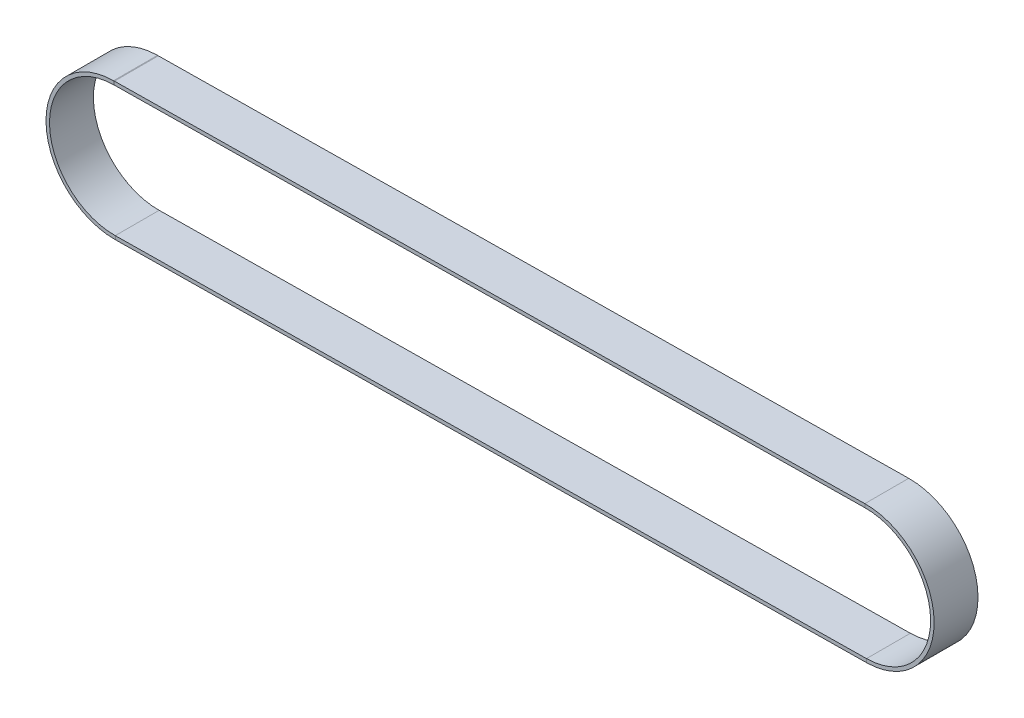
ISO-10303-21;
HEADER;
FILE_DESCRIPTION(('STEP AP214'),'2;1');
FILE_NAME('part.step','',(''),(''),'','','');
FILE_SCHEMA(('AUTOMOTIVE_DESIGN { 1 0 10303 214 1 1 1 1 }'));
ENDSEC;
DATA;
#1=APPLICATION_CONTEXT('core data for automotive mechanical design processes');
#2=APPLICATION_PROTOCOL_DEFINITION('international standard','automotive_design',2000,#1);
#3=PRODUCT_CONTEXT('',#1,'mechanical');
#4=PRODUCT('Part','Part','',(#3));
#5=PRODUCT_RELATED_PRODUCT_CATEGORY('part','',(#4));
#6=PRODUCT_DEFINITION_FORMATION('','',#4);
#7=PRODUCT_DEFINITION_CONTEXT('part definition',#1,'design');
#8=PRODUCT_DEFINITION('design','',#6,#7);
#9=PRODUCT_DEFINITION_SHAPE('','',#8);
#10=(LENGTH_UNIT() NAMED_UNIT(*) SI_UNIT(.MILLI.,.METRE.));
#11=(NAMED_UNIT(*) PLANE_ANGLE_UNIT() SI_UNIT($,.RADIAN.));
#12=(NAMED_UNIT(*) SI_UNIT($,.STERADIAN.) SOLID_ANGLE_UNIT());
#13=UNCERTAINTY_MEASURE_WITH_UNIT(LENGTH_MEASURE(1.E-05),#10,'distance_accuracy_value','');
#14=(GEOMETRIC_REPRESENTATION_CONTEXT(3) GLOBAL_UNCERTAINTY_ASSIGNED_CONTEXT((#13)) GLOBAL_UNIT_ASSIGNED_CONTEXT((#10,
#11,#12)) REPRESENTATION_CONTEXT('',''));
#15=CARTESIAN_POINT('',(0.,0.,0.));
#16=DIRECTION('',(0.,0.,1.));
#17=DIRECTION('',(1.,0.,0.));
#18=AXIS2_PLACEMENT_3D('',#15,#16,#17);
#19=CARTESIAN_POINT('',(427.495798297493,44.299378727653,12.5000000000001));
#20=DIRECTION('',(0.,0.,-1.));
#21=DIRECTION('',(-1.,0.,0.));
#22=AXIS2_PLACEMENT_3D('',#19,#20,#21);
#23=PLANE('',#22);
#24=DIRECTION('',(0.,-1.,0.));
#25=VECTOR('',#24,1.);
#26=CARTESIAN_POINT('',(427.495798297493,44.299378727653,12.5000000000001));
#27=LINE('',#26,#25);
#28=CARTESIAN_POINT('',(427.495798297493,44.299378727653,12.5000000000001));
#29=VERTEX_POINT('',#28);
#30=CARTESIAN_POINT('',(427.495798297493,42.299378727653,12.5000000000001));
#31=VERTEX_POINT('',#30);
#32=EDGE_CURVE('E169',#29,#31,#27,.T.);
#33=ORIENTED_EDGE('',*,*,#32,.F.);
#34=DIRECTION('',(-0.999923089611127,-0.0124022120018218,0.));
#35=VECTOR('',#34,1.);
#36=CARTESIAN_POINT('',(427.495798297493,44.299378727653,12.5000000000001));
#37=LINE('',#36,#35);
#38=CARTESIAN_POINT('',(0.,38.9970774052228,12.5000000000001));
#39=VERTEX_POINT('',#38);
#40=EDGE_CURVE('E168',#29,#39,#37,.T.);
#41=ORIENTED_EDGE('',*,*,#40,.T.);
#42=DIRECTION('',(0.,-1.,0.));
#43=VECTOR('',#42,1.);
#44=CARTESIAN_POINT('',(0.,38.9970774052228,12.5000000000001));
#45=LINE('',#44,#43);
#46=CARTESIAN_POINT('',(0.,36.9970774052228,12.5000000000001));
#47=VERTEX_POINT('',#46);
#48=EDGE_CURVE('E143',#39,#47,#45,.T.);
#49=ORIENTED_EDGE('',*,*,#48,.T.);
#50=DIRECTION('',(-0.999923089611127,-0.0124022120018218,0.));
#51=VECTOR('',#50,1.);
#52=CARTESIAN_POINT('',(427.495798297493,42.299378727653,12.5000000000001));
#53=LINE('',#52,#51);
#54=EDGE_CURVE('E173',#31,#47,#53,.T.);
#55=ORIENTED_EDGE('',*,*,#54,.F.);
#56=EDGE_LOOP('',(#33,#41,#49,#55));
#57=FACE_BOUND('',#56,.T.);
#58=ADVANCED_FACE('F35',(#57),#23,.F.);
#59=CARTESIAN_POINT('',(0.,38.9970774052228,12.5000000000001));
#60=DIRECTION('',(0.,0.,-1.));
#61=DIRECTION('',(-1.,0.,0.));
#62=AXIS2_PLACEMENT_3D('',#59,#60,#61);
#63=PLANE('',#62);
#64=DIRECTION('',(-0.999923089611127,-0.0124022120018218,0.));
#65=VECTOR('',#64,1.);
#66=CARTESIAN_POINT('',(0.,36.9970774052228,12.5000000000001));
#67=LINE('',#66,#65);
#68=CARTESIAN_POINT('',(-0.471284056069227,36.9912319908733,12.5000000000001));
#69=VERTEX_POINT('',#68);
#70=EDGE_CURVE('E149',#47,#69,#67,.T.);
#71=ORIENTED_EDGE('',*,*,#70,.F.);
#72=ORIENTED_EDGE('',*,*,#48,.F.);
#73=DIRECTION('',(-0.999923089611127,-0.0124022120018218,0.));
#74=VECTOR('',#73,1.);
#75=CARTESIAN_POINT('',(0.,38.9970774052228,12.5000000000001));
#76=LINE('',#75,#74);
#77=CARTESIAN_POINT('',(-0.471284056069227,38.9912319908733,12.5000000000001));
#78=VERTEX_POINT('',#77);
#79=EDGE_CURVE('E147',#39,#78,#76,.T.);
#80=ORIENTED_EDGE('',*,*,#79,.T.);
#81=DIRECTION('',(0.,-1.,0.));
#82=VECTOR('',#81,1.);
#83=CARTESIAN_POINT('',(-0.471284056069227,38.9912319908733,12.5000000000001));
#84=LINE('',#83,#82);
#85=EDGE_CURVE('E165',#78,#69,#84,.T.);
#86=ORIENTED_EDGE('',*,*,#85,.T.);
#87=EDGE_LOOP('',(#71,#72,#80,#86));
#88=FACE_BOUND('',#87,.T.);
#89=ADVANCED_FACE('F145',(#88),#63,.F.);
#90=CARTESIAN_POINT('',(0.,36.9970774052228,12.5000000000001));
#91=DIRECTION('',(-0.0124022120018218,0.999923089611127,0.));
#92=DIRECTION('',(-0.999923089611127,-0.0124022120018218,0.));
#93=AXIS2_PLACEMENT_3D('',#90,#91,#92);
#94=PLANE('',#93);
#95=DIRECTION('',(-0.999923089611127,-0.0124022120018218,0.));
#96=VECTOR('',#95,1.);
#97=CARTESIAN_POINT('',(0.,36.9970774052228,-12.4999999999999));
#98=LINE('',#97,#96);
#99=CARTESIAN_POINT('',(0.,36.9970774052228,-12.4999999999999));
#100=VERTEX_POINT('',#99);
#101=CARTESIAN_POINT('',(-0.471284056069227,36.9912319908733,-12.4999999999999));
#102=VERTEX_POINT('',#101);
#103=EDGE_CURVE('E214',#100,#102,#98,.T.);
#104=ORIENTED_EDGE('',*,*,#103,.F.);
#105=DIRECTION('',(0.,0.,-1.));
#106=VECTOR('',#105,1.);
#107=CARTESIAN_POINT('',(0.,36.9970774052228,12.5000000000001));
#108=LINE('',#107,#106);
#109=EDGE_CURVE('E154',#47,#100,#108,.T.);
#110=ORIENTED_EDGE('',*,*,#109,.F.);
#111=ORIENTED_EDGE('',*,*,#70,.T.);
#112=DIRECTION('',(0.,0.,-1.));
#113=VECTOR('',#112,1.);
#114=CARTESIAN_POINT('',(-0.471284056069227,36.9912319908733,12.5000000000001));
#115=LINE('',#114,#113);
#116=EDGE_CURVE('E239',#69,#102,#115,.T.);
#117=ORIENTED_EDGE('',*,*,#116,.T.);
#118=EDGE_LOOP('',(#104,#110,#111,#117));
#119=FACE_BOUND('',#118,.T.);
#120=ADVANCED_FACE('F259',(#119),#94,.F.);
#121=CARTESIAN_POINT('',(0.,38.9970774052228,-12.4999999999999));
#122=DIRECTION('',(0.,0.,1.));
#123=DIRECTION('',(0.,-1.,0.));
#124=AXIS2_PLACEMENT_3D('',#121,#122,#123);
#125=PLANE('',#124);
#126=DIRECTION('',(-0.999923089611127,-0.0124022120018218,0.));
#127=VECTOR('',#126,1.);
#128=CARTESIAN_POINT('',(0.,38.9970774052228,-12.4999999999999));
#129=LINE('',#128,#127);
#130=CARTESIAN_POINT('',(0.,38.9970774052228,-12.4999999999999));
#131=VERTEX_POINT('',#130);
#132=CARTESIAN_POINT('',(-0.471284056069227,38.9912319908733,-12.4999999999999));
#133=VERTEX_POINT('',#132);
#134=EDGE_CURVE('E184',#131,#133,#129,.T.);
#135=ORIENTED_EDGE('',*,*,#134,.F.);
#136=DIRECTION('',(0.,1.,0.));
#137=VECTOR('',#136,1.);
#138=CARTESIAN_POINT('',(0.,38.9970774052228,-12.4999999999999));
#139=LINE('',#138,#137);
#140=EDGE_CURVE('E176',#100,#131,#139,.T.);
#141=ORIENTED_EDGE('',*,*,#140,.F.);
#142=ORIENTED_EDGE('',*,*,#103,.T.);
#143=DIRECTION('',(0.,1.,0.));
#144=VECTOR('',#143,1.);
#145=CARTESIAN_POINT('',(-0.471284056069227,38.9912319908733,-12.4999999999999));
#146=LINE('',#145,#144);
#147=EDGE_CURVE('E216',#102,#133,#146,.T.);
#148=ORIENTED_EDGE('',*,*,#147,.T.);
#149=EDGE_LOOP('',(#135,#141,#142,#148));
#150=FACE_BOUND('',#149,.T.);
#151=ADVANCED_FACE('F212',(#150),#125,.F.);
#152=CARTESIAN_POINT('',(0.,38.9970774052228,12.5000000000001));
#153=DIRECTION('',(0.0124022120018218,-0.999923089611127,0.));
#154=DIRECTION('',(0.999923089611127,0.0124022120018218,0.));
#155=AXIS2_PLACEMENT_3D('',#152,#153,#154);
#156=PLANE('',#155);
#157=DIRECTION('',(0.,0.,1.));
#158=VECTOR('',#157,1.);
#159=CARTESIAN_POINT('',(-0.471284056069227,38.9912319908733,12.5000000000001));
#160=LINE('',#159,#158);
#161=EDGE_CURVE('E163',#133,#78,#160,.T.);
#162=ORIENTED_EDGE('',*,*,#161,.T.);
#163=ORIENTED_EDGE('',*,*,#79,.F.);
#164=DIRECTION('',(0.,0.,1.));
#165=VECTOR('',#164,1.);
#166=CARTESIAN_POINT('',(0.,38.9970774052228,12.5000000000001));
#167=LINE('',#166,#165);
#168=EDGE_CURVE('E161',#131,#39,#167,.T.);
#169=ORIENTED_EDGE('',*,*,#168,.F.);
#170=ORIENTED_EDGE('',*,*,#134,.T.);
#171=EDGE_LOOP('',(#162,#163,#169,#170));
#172=FACE_BOUND('',#171,.T.);
#173=ADVANCED_FACE('F159',(#172),#156,.F.);
#174=CARTESIAN_POINT('',(-0.471284056069228,38.9912319908733,12.5000000000001));
#175=DIRECTION('',(0.,0.,-1.));
#176=DIRECTION('',(-1.,0.,0.));
#177=AXIS2_PLACEMENT_3D('',#174,#175,#176);
#178=PLANE('',#177);
#179=CARTESIAN_POINT('',(0.,0.,12.5000000000001));
#180=DIRECTION('',(0.,0.,1.));
#181=DIRECTION('',(-0.0127393921832897,0.999918850650792,0.));
#182=AXIS2_PLACEMENT_3D('',#179,#180,#181);
#183=CIRCLE('',#182,36.9942340488908);
#184=CARTESIAN_POINT('',(0.471284056069207,-36.9912319908733,12.5000000000001));
#185=VERTEX_POINT('',#184);
#186=EDGE_CURVE('E128',#69,#185,#183,.T.);
#187=ORIENTED_EDGE('',*,*,#186,.F.);
#188=ORIENTED_EDGE('',*,*,#85,.F.);
#189=CARTESIAN_POINT('',(0.,0.,12.5000000000001));
#190=DIRECTION('',(0.,0.,1.));
#191=DIRECTION('',(-0.0120860411419707,0.99992696113742,0.));
#192=AXIS2_PLACEMENT_3D('',#189,#190,#191);
#193=CIRCLE('',#192,38.9940800741293);
#194=CARTESIAN_POINT('',(0.471284056069205,-38.9912319908733,12.5000000000001));
#195=VERTEX_POINT('',#194);
#196=EDGE_CURVE('E183',#78,#195,#193,.T.);
#197=ORIENTED_EDGE('',*,*,#196,.T.);
#198=DIRECTION('',(0.,1.,0.));
#199=VECTOR('',#198,1.);
#200=CARTESIAN_POINT('',(0.471284056069205,-38.9912319908733,12.5000000000001));
#201=LINE('',#200,#199);
#202=EDGE_CURVE('E244',#195,#185,#201,.T.);
#203=ORIENTED_EDGE('',*,*,#202,.T.);
#204=EDGE_LOOP('',(#187,#188,#197,#203));
#205=FACE_BOUND('',#204,.T.);
#206=ADVANCED_FACE('F284',(#205),#178,.F.);
#207=CARTESIAN_POINT('',(0.,0.,0.));
#208=DIRECTION('',(0.,0.,1.));
#209=DIRECTION('',(1.,0.,0.));
#210=AXIS2_PLACEMENT_3D('',#207,#208,#209);
#211=CYLINDRICAL_SURFACE('',#210,36.9942340488908);
#212=CARTESIAN_POINT('',(0.,0.,-12.4999999999999));
#213=DIRECTION('',(0.,0.,1.));
#214=DIRECTION('',(-0.0127393921832897,0.999918850650792,0.));
#215=AXIS2_PLACEMENT_3D('',#212,#213,#214);
#216=CIRCLE('',#215,36.9942340488908);
#217=CARTESIAN_POINT('',(0.471284056069207,-36.9912319908733,-12.4999999999999));
#218=VERTEX_POINT('',#217);
#219=EDGE_CURVE('E122',#102,#218,#216,.T.);
#220=ORIENTED_EDGE('',*,*,#219,.F.);
#221=ORIENTED_EDGE('',*,*,#116,.F.);
#222=ORIENTED_EDGE('',*,*,#186,.T.);
#223=DIRECTION('',(0.,0.,-1.));
#224=VECTOR('',#223,1.);
#225=CARTESIAN_POINT('',(0.471284056069206,-36.9912319908733,12.5000000000001));
#226=LINE('',#225,#224);
#227=EDGE_CURVE('E221',#185,#218,#226,.T.);
#228=ORIENTED_EDGE('',*,*,#227,.T.);
#229=EDGE_LOOP('',(#220,#221,#222,#228));
#230=FACE_BOUND('',#229,.T.);
#231=ADVANCED_FACE('F286',(#230),#211,.F.);
#232=CARTESIAN_POINT('',(-0.471284056069228,38.9912319908733,-12.4999999999999));
#233=DIRECTION('',(0.,0.,1.));
#234=DIRECTION('',(1.,0.,0.));
#235=AXIS2_PLACEMENT_3D('',#232,#233,#234);
#236=PLANE('',#235);
#237=CARTESIAN_POINT('',(0.,0.,-12.4999999999999));
#238=DIRECTION('',(0.,0.,1.));
#239=DIRECTION('',(-0.0120860411419707,0.99992696113742,0.));
#240=AXIS2_PLACEMENT_3D('',#237,#238,#239);
#241=CIRCLE('',#240,38.9940800741293);
#242=CARTESIAN_POINT('',(0.471284056069205,-38.9912319908733,-12.4999999999999));
#243=VERTEX_POINT('',#242);
#244=EDGE_CURVE('E188',#133,#243,#241,.T.);
#245=ORIENTED_EDGE('',*,*,#244,.F.);
#246=ORIENTED_EDGE('',*,*,#147,.F.);
#247=ORIENTED_EDGE('',*,*,#219,.T.);
#248=DIRECTION('',(0.,-1.,0.));
#249=VECTOR('',#248,1.);
#250=CARTESIAN_POINT('',(0.471284056069205,-38.9912319908733,-12.4999999999999));
#251=LINE('',#250,#249);
#252=EDGE_CURVE('E220',#218,#243,#251,.T.);
#253=ORIENTED_EDGE('',*,*,#252,.T.);
#254=EDGE_LOOP('',(#245,#246,#247,#253));
#255=FACE_BOUND('',#254,.T.);
#256=ADVANCED_FACE('F292',(#255),#236,.F.);
#257=CARTESIAN_POINT('',(0.,0.,0.));
#258=DIRECTION('',(0.,0.,1.));
#259=DIRECTION('',(1.,0.,0.));
#260=AXIS2_PLACEMENT_3D('',#257,#258,#259);
#261=CYLINDRICAL_SURFACE('',#260,38.9940800741293);
#262=DIRECTION('',(0.,0.,1.));
#263=VECTOR('',#262,1.);
#264=CARTESIAN_POINT('',(0.471284056069205,-38.9912319908733,12.5000000000001));
#265=LINE('',#264,#263);
#266=EDGE_CURVE('E185',#243,#195,#265,.T.);
#267=ORIENTED_EDGE('',*,*,#266,.T.);
#268=ORIENTED_EDGE('',*,*,#196,.F.);
#269=ORIENTED_EDGE('',*,*,#161,.F.);
#270=ORIENTED_EDGE('',*,*,#244,.T.);
#271=EDGE_LOOP('',(#267,#268,#269,#270));
#272=FACE_BOUND('',#271,.T.);
#273=ADVANCED_FACE('F282',(#272),#261,.T.);
#274=CARTESIAN_POINT('',(0.471284056069221,-38.9912319908733,12.5000000000001));
#275=DIRECTION('',(0.,0.,-1.));
#276=DIRECTION('',(-1.,0.,0.));
#277=AXIS2_PLACEMENT_3D('',#274,#275,#276);
#278=PLANE('',#277);
#279=DIRECTION('',(0.999923089611127,0.0124022120018218,0.));
#280=VECTOR('',#279,1.);
#281=CARTESIAN_POINT('',(0.471284056069221,-36.9912319908733,12.5000000000001));
#282=LINE('',#281,#280);
#283=CARTESIAN_POINT('',(428.438366409632,-31.6830852540936,12.5000000000001));
#284=VERTEX_POINT('',#283);
#285=EDGE_CURVE('E105',#185,#284,#282,.T.);
#286=ORIENTED_EDGE('',*,*,#285,.F.);
#287=ORIENTED_EDGE('',*,*,#202,.F.);
#288=DIRECTION('',(0.999923089611127,0.0124022120018218,0.));
#289=VECTOR('',#288,1.);
#290=CARTESIAN_POINT('',(0.471284056069221,-38.9912319908733,12.5000000000001));
#291=LINE('',#290,#289);
#292=CARTESIAN_POINT('',(428.438366409632,-33.6830852540936,12.5000000000001));
#293=VERTEX_POINT('',#292);
#294=EDGE_CURVE('E187',#195,#293,#291,.T.);
#295=ORIENTED_EDGE('',*,*,#294,.T.);
#296=DIRECTION('',(0.,1.,0.));
#297=VECTOR('',#296,1.);
#298=CARTESIAN_POINT('',(428.438366409632,-33.6830852540936,12.5000000000001));
#299=LINE('',#298,#297);
#300=EDGE_CURVE('E197',#293,#284,#299,.T.);
#301=ORIENTED_EDGE('',*,*,#300,.T.);
#302=EDGE_LOOP('',(#286,#287,#295,#301));
#303=FACE_BOUND('',#302,.T.);
#304=ADVANCED_FACE('F278',(#303),#278,.F.);
#305=CARTESIAN_POINT('',(0.471284056069221,-36.9912319908733,12.5000000000001));
#306=DIRECTION('',(0.0124022120018218,-0.999923089611127,0.));
#307=DIRECTION('',(0.999923089611127,0.0124022120018218,0.));
#308=AXIS2_PLACEMENT_3D('',#305,#306,#307);
#309=PLANE('',#308);
#310=DIRECTION('',(0.999923089611127,0.0124022120018218,0.));
#311=VECTOR('',#310,1.);
#312=CARTESIAN_POINT('',(0.471284056069221,-36.9912319908733,-12.4999999999999));
#313=LINE('',#312,#311);
#314=CARTESIAN_POINT('',(428.438366409632,-31.6830852540936,-12.4999999999999));
#315=VERTEX_POINT('',#314);
#316=EDGE_CURVE('E98',#218,#315,#313,.T.);
#317=ORIENTED_EDGE('',*,*,#316,.F.);
#318=ORIENTED_EDGE('',*,*,#227,.F.);
#319=ORIENTED_EDGE('',*,*,#285,.T.);
#320=DIRECTION('',(0.,0.,-1.));
#321=VECTOR('',#320,1.);
#322=CARTESIAN_POINT('',(428.438366409632,-31.6830852540936,12.5000000000001));
#323=LINE('',#322,#321);
#324=EDGE_CURVE('E195',#284,#315,#323,.T.);
#325=ORIENTED_EDGE('',*,*,#324,.T.);
#326=EDGE_LOOP('',(#317,#318,#319,#325));
#327=FACE_BOUND('',#326,.T.);
#328=ADVANCED_FACE('F281',(#327),#309,.F.);
#329=CARTESIAN_POINT('',(0.471284056069221,-38.9912319908733,-12.4999999999999));
#330=DIRECTION('',(0.,0.,1.));
#331=DIRECTION('',(0.,-1.,0.));
#332=AXIS2_PLACEMENT_3D('',#329,#330,#331);
#333=PLANE('',#332);
#334=DIRECTION('',(0.999923089611127,0.0124022120018218,0.));
#335=VECTOR('',#334,1.);
#336=CARTESIAN_POINT('',(0.471284056069221,-38.9912319908733,-12.4999999999999));
#337=LINE('',#336,#335);
#338=CARTESIAN_POINT('',(428.438366409632,-33.6830852540936,-12.4999999999999));
#339=VERTEX_POINT('',#338);
#340=EDGE_CURVE('E89',#243,#339,#337,.T.);
#341=ORIENTED_EDGE('',*,*,#340,.F.);
#342=ORIENTED_EDGE('',*,*,#252,.F.);
#343=ORIENTED_EDGE('',*,*,#316,.T.);
#344=DIRECTION('',(0.,-1.,0.));
#345=VECTOR('',#344,1.);
#346=CARTESIAN_POINT('',(428.438366409632,-33.6830852540936,-12.4999999999999));
#347=LINE('',#346,#345);
#348=EDGE_CURVE('E191',#315,#339,#347,.T.);
#349=ORIENTED_EDGE('',*,*,#348,.T.);
#350=EDGE_LOOP('',(#341,#342,#343,#349));
#351=FACE_BOUND('',#350,.T.);
#352=ADVANCED_FACE('F296',(#351),#333,.F.);
#353=CARTESIAN_POINT('',(0.471284056069221,-38.9912319908733,12.5000000000001));
#354=DIRECTION('',(-0.0124022120018218,0.999923089611127,0.));
#355=DIRECTION('',(-0.999923089611127,-0.0124022120018218,0.));
#356=AXIS2_PLACEMENT_3D('',#353,#354,#355);
#357=PLANE('',#356);
#358=DIRECTION('',(0.,0.,1.));
#359=VECTOR('',#358,1.);
#360=CARTESIAN_POINT('',(428.438366409632,-33.6830852540936,12.5000000000001));
#361=LINE('',#360,#359);
#362=EDGE_CURVE('E189',#339,#293,#361,.T.);
#363=ORIENTED_EDGE('',*,*,#362,.T.);
#364=ORIENTED_EDGE('',*,*,#294,.F.);
#365=ORIENTED_EDGE('',*,*,#266,.F.);
#366=ORIENTED_EDGE('',*,*,#340,.T.);
#367=EDGE_LOOP('',(#363,#364,#365,#366));
#368=FACE_BOUND('',#367,.T.);
#369=ADVANCED_FACE('F277',(#368),#357,.F.);
#370=CARTESIAN_POINT('',(428.438366409632,-33.6830852540936,12.5000000000001));
#371=DIRECTION('',(0.,0.,-1.));
#372=DIRECTION('',(-1.,0.,0.));
#373=AXIS2_PLACEMENT_3D('',#370,#371,#372);
#374=PLANE('',#373);
#375=CARTESIAN_POINT('',(427.967082353562,5.30814673677972,12.5000000000001));
#376=DIRECTION('',(0.,0.,1.));
#377=DIRECTION('',(0.0127393921832895,-0.999918850650792,0.));
#378=AXIS2_PLACEMENT_3D('',#375,#376,#377);
#379=CIRCLE('',#378,36.9942340488908);
#380=EDGE_CURVE('E229',#284,#31,#379,.T.);
#381=ORIENTED_EDGE('',*,*,#380,.F.);
#382=ORIENTED_EDGE('',*,*,#300,.F.);
#383=CARTESIAN_POINT('',(427.967082353562,5.30814673677972,12.5000000000001));
#384=DIRECTION('',(0.,0.,1.));
#385=DIRECTION('',(0.0120860411419706,-0.99992696113742,0.));
#386=AXIS2_PLACEMENT_3D('',#383,#384,#385);
#387=CIRCLE('',#386,38.9940800741293);
#388=EDGE_CURVE('E190',#293,#29,#387,.T.);
#389=ORIENTED_EDGE('',*,*,#388,.T.);
#390=ORIENTED_EDGE('',*,*,#32,.T.);
#391=EDGE_LOOP('',(#381,#382,#389,#390));
#392=FACE_BOUND('',#391,.T.);
#393=ADVANCED_FACE('F274',(#392),#374,.F.);
#394=CARTESIAN_POINT('',(427.967082353562,5.30814673677972,0.));
#395=DIRECTION('',(0.,0.,1.));
#396=DIRECTION('',(1.,0.,0.));
#397=AXIS2_PLACEMENT_3D('',#394,#395,#396);
#398=CYLINDRICAL_SURFACE('',#397,36.9942340488908);
#399=CARTESIAN_POINT('',(427.967082353562,5.30814673677972,-12.4999999999999));
#400=DIRECTION('',(0.,0.,1.));
#401=DIRECTION('',(0.0127393921832895,-0.999918850650792,0.));
#402=AXIS2_PLACEMENT_3D('',#399,#400,#401);
#403=CIRCLE('',#402,36.9942340488908);
#404=CARTESIAN_POINT('',(427.495798297493,42.299378727653,-12.4999999999999));
#405=VERTEX_POINT('',#404);
#406=EDGE_CURVE('E60',#315,#405,#403,.T.);
#407=ORIENTED_EDGE('',*,*,#406,.F.);
#408=ORIENTED_EDGE('',*,*,#324,.F.);
#409=ORIENTED_EDGE('',*,*,#380,.T.);
#410=DIRECTION('',(0.,0.,-1.));
#411=VECTOR('',#410,1.);
#412=CARTESIAN_POINT('',(427.495798297493,42.299378727653,12.5000000000001));
#413=LINE('',#412,#411);
#414=EDGE_CURVE('E227',#31,#405,#413,.T.);
#415=ORIENTED_EDGE('',*,*,#414,.T.);
#416=EDGE_LOOP('',(#407,#408,#409,#415));
#417=FACE_BOUND('',#416,.T.);
#418=ADVANCED_FACE('F255',(#417),#398,.F.);
#419=CARTESIAN_POINT('',(428.438366409632,-33.6830852540936,-12.4999999999999));
#420=DIRECTION('',(0.,0.,1.));
#421=DIRECTION('',(1.,0.,0.));
#422=AXIS2_PLACEMENT_3D('',#419,#420,#421);
#423=PLANE('',#422);
#424=CARTESIAN_POINT('',(427.967082353562,5.30814673677972,-12.4999999999999));
#425=DIRECTION('',(0.,0.,1.));
#426=DIRECTION('',(0.0120860411419706,-0.99992696113742,0.));
#427=AXIS2_PLACEMENT_3D('',#424,#425,#426);
#428=CIRCLE('',#427,38.9940800741293);
#429=CARTESIAN_POINT('',(427.495798297493,44.299378727653,-12.4999999999999));
#430=VERTEX_POINT('',#429);
#431=EDGE_CURVE('E52',#339,#430,#428,.T.);
#432=ORIENTED_EDGE('',*,*,#431,.F.);
#433=ORIENTED_EDGE('',*,*,#348,.F.);
#434=ORIENTED_EDGE('',*,*,#406,.T.);
#435=DIRECTION('',(0.,1.,0.));
#436=VECTOR('',#435,1.);
#437=CARTESIAN_POINT('',(427.495798297493,44.299378727653,-12.4999999999999));
#438=LINE('',#437,#436);
#439=EDGE_CURVE('E203',#405,#430,#438,.T.);
#440=ORIENTED_EDGE('',*,*,#439,.T.);
#441=EDGE_LOOP('',(#432,#433,#434,#440));
#442=FACE_BOUND('',#441,.T.);
#443=ADVANCED_FACE('F305',(#442),#423,.F.);
#444=CARTESIAN_POINT('',(427.967082353562,5.30814673677972,0.));
#445=DIRECTION('',(0.,0.,1.));
#446=DIRECTION('',(1.,0.,0.));
#447=AXIS2_PLACEMENT_3D('',#444,#445,#446);
#448=CYLINDRICAL_SURFACE('',#447,38.9940800741293);
#449=DIRECTION('',(0.,0.,1.));
#450=VECTOR('',#449,1.);
#451=CARTESIAN_POINT('',(427.495798297493,44.299378727653,12.5000000000001));
#452=LINE('',#451,#450);
#453=EDGE_CURVE('E39',#430,#29,#452,.T.);
#454=ORIENTED_EDGE('',*,*,#453,.T.);
#455=ORIENTED_EDGE('',*,*,#388,.F.);
#456=ORIENTED_EDGE('',*,*,#362,.F.);
#457=ORIENTED_EDGE('',*,*,#431,.T.);
#458=EDGE_LOOP('',(#454,#455,#456,#457));
#459=FACE_BOUND('',#458,.T.);
#460=ADVANCED_FACE('F204',(#459),#448,.T.);
#461=CARTESIAN_POINT('',(427.495798297493,42.299378727653,12.5000000000001));
#462=DIRECTION('',(-0.0124022120018218,0.999923089611127,0.));
#463=DIRECTION('',(-0.999923089611127,-0.0124022120018218,0.));
#464=AXIS2_PLACEMENT_3D('',#461,#462,#463);
#465=PLANE('',#464);
#466=ORIENTED_EDGE('',*,*,#54,.T.);
#467=ORIENTED_EDGE('',*,*,#109,.T.);
#468=DIRECTION('',(-0.999923089611127,-0.0124022120018218,0.));
#469=VECTOR('',#468,1.);
#470=CARTESIAN_POINT('',(427.495798297493,42.299378727653,-12.4999999999999));
#471=LINE('',#470,#469);
#472=EDGE_CURVE('E44',#405,#100,#471,.T.);
#473=ORIENTED_EDGE('',*,*,#472,.F.);
#474=ORIENTED_EDGE('',*,*,#414,.F.);
#475=EDGE_LOOP('',(#466,#467,#473,#474));
#476=FACE_BOUND('',#475,.T.);
#477=ADVANCED_FACE('F258',(#476),#465,.F.);
#478=CARTESIAN_POINT('',(427.495798297493,44.299378727653,-12.4999999999999));
#479=DIRECTION('',(0.,0.,1.));
#480=DIRECTION('',(0.,-1.,0.));
#481=AXIS2_PLACEMENT_3D('',#478,#479,#480);
#482=PLANE('',#481);
#483=ORIENTED_EDGE('',*,*,#472,.T.);
#484=ORIENTED_EDGE('',*,*,#140,.T.);
#485=DIRECTION('',(-0.999923089611127,-0.0124022120018218,0.));
#486=VECTOR('',#485,1.);
#487=CARTESIAN_POINT('',(427.495798297493,44.299378727653,-12.4999999999999));
#488=LINE('',#487,#486);
#489=EDGE_CURVE('E11',#430,#131,#488,.T.);
#490=ORIENTED_EDGE('',*,*,#489,.F.);
#491=ORIENTED_EDGE('',*,*,#439,.F.);
#492=EDGE_LOOP('',(#483,#484,#490,#491));
#493=FACE_BOUND('',#492,.T.);
#494=ADVANCED_FACE('F208',(#493),#482,.F.);
#495=CARTESIAN_POINT('',(427.495798297493,44.299378727653,12.5000000000001));
#496=DIRECTION('',(0.0124022120018218,-0.999923089611127,0.));
#497=DIRECTION('',(0.999923089611127,0.0124022120018218,0.));
#498=AXIS2_PLACEMENT_3D('',#495,#496,#497);
#499=PLANE('',#498);
#500=ORIENTED_EDGE('',*,*,#489,.T.);
#501=ORIENTED_EDGE('',*,*,#168,.T.);
#502=ORIENTED_EDGE('',*,*,#40,.F.);
#503=ORIENTED_EDGE('',*,*,#453,.F.);
#504=EDGE_LOOP('',(#500,#501,#502,#503));
#505=FACE_BOUND('',#504,.T.);
#506=ADVANCED_FACE('F37',(#505),#499,.F.);
#507=CLOSED_SHELL('',(#58,#89,#120,#151,#173,#206,#231,#256,#273,#304,#328,#352,#369,#393,#418,
#443,#460,#477,#494,#506));
#508=MANIFOLD_SOLID_BREP('B2',#507);
#509=ADVANCED_BREP_SHAPE_REPRESENTATION('',(#18,#508),#14);
#510=SHAPE_DEFINITION_REPRESENTATION(#9,#509);
ENDSEC;
END-ISO-10303-21;
